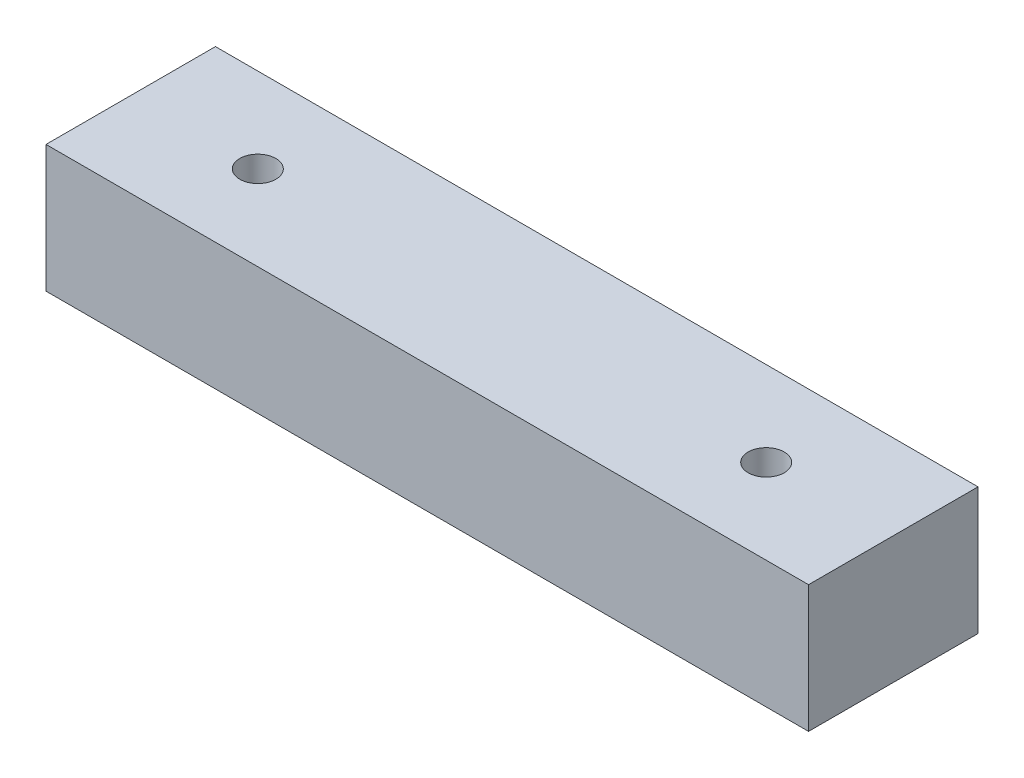
ISO-10303-21;
HEADER;
FILE_DESCRIPTION(('STEP AP214'),'2;1');
FILE_NAME('part.step','',(''),(''),'','','');
FILE_SCHEMA(('AUTOMOTIVE_DESIGN { 1 0 10303 214 1 1 1 1 }'));
ENDSEC;
DATA;
#1=APPLICATION_CONTEXT('core data for automotive mechanical design processes');
#2=APPLICATION_PROTOCOL_DEFINITION('international standard','automotive_design',2000,#1);
#3=PRODUCT_CONTEXT('',#1,'mechanical');
#4=PRODUCT('Part','Part','',(#3));
#5=PRODUCT_RELATED_PRODUCT_CATEGORY('part','',(#4));
#6=PRODUCT_DEFINITION_FORMATION('','',#4);
#7=PRODUCT_DEFINITION_CONTEXT('part definition',#1,'design');
#8=PRODUCT_DEFINITION('design','',#6,#7);
#9=PRODUCT_DEFINITION_SHAPE('','',#8);
#10=(LENGTH_UNIT() NAMED_UNIT(*) SI_UNIT(.MILLI.,.METRE.));
#11=(NAMED_UNIT(*) PLANE_ANGLE_UNIT() SI_UNIT($,.RADIAN.));
#12=(NAMED_UNIT(*) SI_UNIT($,.STERADIAN.) SOLID_ANGLE_UNIT());
#13=UNCERTAINTY_MEASURE_WITH_UNIT(LENGTH_MEASURE(1.E-05),#10,'distance_accuracy_value','');
#14=(GEOMETRIC_REPRESENTATION_CONTEXT(3) GLOBAL_UNCERTAINTY_ASSIGNED_CONTEXT((#13)) GLOBAL_UNIT_ASSIGNED_CONTEXT((#10,
#11,#12)) REPRESENTATION_CONTEXT('',''));
#15=CARTESIAN_POINT('',(0.,0.,0.));
#16=DIRECTION('',(0.,0.,1.));
#17=DIRECTION('',(1.,0.,0.));
#18=AXIS2_PLACEMENT_3D('',#15,#16,#17);
#19=CARTESIAN_POINT('',(-28.575,9.525,6.35));
#20=DIRECTION('',(1.,0.,0.));
#21=DIRECTION('',(0.,0.,-1.));
#22=AXIS2_PLACEMENT_3D('',#19,#20,#21);
#23=PLANE('',#22);
#24=DIRECTION('',(0.,0.,1.));
#25=VECTOR('',#24,1.);
#26=CARTESIAN_POINT('',(-28.575,0.,6.35));
#27=LINE('',#26,#25);
#28=CARTESIAN_POINT('',(-28.575,0.,-6.35));
#29=VERTEX_POINT('',#28);
#30=CARTESIAN_POINT('',(-28.575,0.,6.35));
#31=VERTEX_POINT('',#30);
#32=EDGE_CURVE('E97',#29,#31,#27,.T.);
#33=ORIENTED_EDGE('',*,*,#32,.T.);
#34=DIRECTION('',(0.,-1.,0.));
#35=VECTOR('',#34,1.);
#36=CARTESIAN_POINT('',(-28.575,9.525,6.35));
#37=LINE('',#36,#35);
#38=CARTESIAN_POINT('',(-28.575,9.525,6.35));
#39=VERTEX_POINT('',#38);
#40=EDGE_CURVE('E11',#39,#31,#37,.T.);
#41=ORIENTED_EDGE('',*,*,#40,.F.);
#42=DIRECTION('',(0.,0.,1.));
#43=VECTOR('',#42,1.);
#44=CARTESIAN_POINT('',(-28.575,9.525,6.35));
#45=LINE('',#44,#43);
#46=CARTESIAN_POINT('',(-28.575,9.525,-6.35));
#47=VERTEX_POINT('',#46);
#48=EDGE_CURVE('E85',#47,#39,#45,.T.);
#49=ORIENTED_EDGE('',*,*,#48,.F.);
#50=DIRECTION('',(0.,-1.,0.));
#51=VECTOR('',#50,1.);
#52=CARTESIAN_POINT('',(-28.575,9.525,-6.35));
#53=LINE('',#52,#51);
#54=EDGE_CURVE('E93',#47,#29,#53,.T.);
#55=ORIENTED_EDGE('',*,*,#54,.T.);
#56=EDGE_LOOP('',(#33,#41,#49,#55));
#57=FACE_BOUND('',#56,.T.);
#58=ADVANCED_FACE('F34',(#57),#23,.F.);
#59=CARTESIAN_POINT('',(28.575,9.525,6.35));
#60=DIRECTION('',(0.,0.,-1.));
#61=DIRECTION('',(-1.,0.,0.));
#62=AXIS2_PLACEMENT_3D('',#59,#60,#61);
#63=PLANE('',#62);
#64=DIRECTION('',(1.,0.,0.));
#65=VECTOR('',#64,1.);
#66=CARTESIAN_POINT('',(28.575,0.,6.35));
#67=LINE('',#66,#65);
#68=CARTESIAN_POINT('',(28.575,0.,6.35));
#69=VERTEX_POINT('',#68);
#70=EDGE_CURVE('E89',#31,#69,#67,.T.);
#71=ORIENTED_EDGE('',*,*,#70,.T.);
#72=DIRECTION('',(0.,-1.,0.));
#73=VECTOR('',#72,1.);
#74=CARTESIAN_POINT('',(28.575,9.525,6.35));
#75=LINE('',#74,#73);
#76=CARTESIAN_POINT('',(28.575,9.525,6.35));
#77=VERTEX_POINT('',#76);
#78=EDGE_CURVE('E42',#77,#69,#75,.T.);
#79=ORIENTED_EDGE('',*,*,#78,.F.);
#80=DIRECTION('',(1.,0.,0.));
#81=VECTOR('',#80,1.);
#82=CARTESIAN_POINT('',(28.575,9.525,6.35));
#83=LINE('',#82,#81);
#84=EDGE_CURVE('E80',#39,#77,#83,.T.);
#85=ORIENTED_EDGE('',*,*,#84,.F.);
#86=ORIENTED_EDGE('',*,*,#40,.T.);
#87=EDGE_LOOP('',(#71,#79,#85,#86));
#88=FACE_BOUND('',#87,.T.);
#89=ADVANCED_FACE('F88',(#88),#63,.F.);
#90=CARTESIAN_POINT('',(28.575,9.525,6.35));
#91=DIRECTION('',(-1.,0.,0.));
#92=DIRECTION('',(0.,0.,1.));
#93=AXIS2_PLACEMENT_3D('',#90,#91,#92);
#94=PLANE('',#93);
#95=DIRECTION('',(0.,0.,-1.));
#96=VECTOR('',#95,1.);
#97=CARTESIAN_POINT('',(28.575,0.,6.35));
#98=LINE('',#97,#96);
#99=CARTESIAN_POINT('',(28.575,0.,-6.35));
#100=VERTEX_POINT('',#99);
#101=EDGE_CURVE('E67',#69,#100,#98,.T.);
#102=ORIENTED_EDGE('',*,*,#101,.T.);
#103=DIRECTION('',(0.,-1.,0.));
#104=VECTOR('',#103,1.);
#105=CARTESIAN_POINT('',(28.575,9.525,-6.35));
#106=LINE('',#105,#104);
#107=CARTESIAN_POINT('',(28.575,9.525,-6.35));
#108=VERTEX_POINT('',#107);
#109=EDGE_CURVE('E90',#108,#100,#106,.T.);
#110=ORIENTED_EDGE('',*,*,#109,.F.);
#111=DIRECTION('',(0.,0.,-1.));
#112=VECTOR('',#111,1.);
#113=CARTESIAN_POINT('',(28.575,9.525,6.35));
#114=LINE('',#113,#112);
#115=EDGE_CURVE('E83',#77,#108,#114,.T.);
#116=ORIENTED_EDGE('',*,*,#115,.F.);
#117=ORIENTED_EDGE('',*,*,#78,.T.);
#118=EDGE_LOOP('',(#102,#110,#116,#117));
#119=FACE_BOUND('',#118,.T.);
#120=ADVANCED_FACE('F91',(#119),#94,.F.);
#121=CARTESIAN_POINT('',(28.575,9.525,-6.35));
#122=DIRECTION('',(0.,0.,1.));
#123=DIRECTION('',(1.,0.,0.));
#124=AXIS2_PLACEMENT_3D('',#121,#122,#123);
#125=PLANE('',#124);
#126=DIRECTION('',(-1.,0.,0.));
#127=VECTOR('',#126,1.);
#128=CARTESIAN_POINT('',(28.575,0.,-6.35));
#129=LINE('',#128,#127);
#130=EDGE_CURVE('E73',#100,#29,#129,.T.);
#131=ORIENTED_EDGE('',*,*,#130,.T.);
#132=ORIENTED_EDGE('',*,*,#54,.F.);
#133=DIRECTION('',(-1.,0.,0.));
#134=VECTOR('',#133,1.);
#135=CARTESIAN_POINT('',(28.575,9.525,-6.35));
#136=LINE('',#135,#134);
#137=EDGE_CURVE('E50',#108,#47,#136,.T.);
#138=ORIENTED_EDGE('',*,*,#137,.F.);
#139=ORIENTED_EDGE('',*,*,#109,.T.);
#140=EDGE_LOOP('',(#131,#132,#138,#139));
#141=FACE_BOUND('',#140,.T.);
#142=ADVANCED_FACE('F105',(#141),#125,.F.);
#143=CARTESIAN_POINT('',(-28.575,9.525,-6.35));
#144=DIRECTION('',(0.,1.,0.));
#145=DIRECTION('',(0.,0.,1.));
#146=AXIS2_PLACEMENT_3D('',#143,#144,#145);
#147=PLANE('',#146);
#148=CARTESIAN_POINT('',(19.05,9.525,0.));
#149=DIRECTION('',(0.,-1.,0.));
#150=DIRECTION('',(0.,0.,-1.));
#151=AXIS2_PLACEMENT_3D('',#148,#149,#150);
#152=CIRCLE('',#151,1.35255);
#153=CARTESIAN_POINT('',(19.05,9.525,-1.35255));
#154=VERTEX_POINT('',#153);
#155=EDGE_CURVE('E116',#154,#154,#152,.T.);
#156=ORIENTED_EDGE('',*,*,#155,.T.);
#157=EDGE_LOOP('',(#156));
#158=FACE_BOUND('',#157,.T.);
#159=CARTESIAN_POINT('',(-19.05,9.525,0.));
#160=DIRECTION('',(0.,-1.,0.));
#161=DIRECTION('',(0.,0.,-1.));
#162=AXIS2_PLACEMENT_3D('',#159,#160,#161);
#163=CIRCLE('',#162,1.35255);
#164=CARTESIAN_POINT('',(-19.05,9.525,-1.35255));
#165=VERTEX_POINT('',#164);
#166=EDGE_CURVE('E100',#165,#165,#163,.T.);
#167=ORIENTED_EDGE('',*,*,#166,.T.);
#168=EDGE_LOOP('',(#167));
#169=FACE_BOUND('',#168,.T.);
#170=ORIENTED_EDGE('',*,*,#48,.T.);
#171=ORIENTED_EDGE('',*,*,#84,.T.);
#172=ORIENTED_EDGE('',*,*,#115,.T.);
#173=ORIENTED_EDGE('',*,*,#137,.T.);
#174=EDGE_LOOP('',(#170,#171,#172,#173));
#175=FACE_BOUND('',#174,.T.);
#176=ADVANCED_FACE('F81',(#158,#169,#175),#147,.T.);
#177=CARTESIAN_POINT('',(-28.575,0.,-6.35));
#178=DIRECTION('',(0.,1.,0.));
#179=DIRECTION('',(0.,0.,1.));
#180=AXIS2_PLACEMENT_3D('',#177,#178,#179);
#181=PLANE('',#180);
#182=CARTESIAN_POINT('',(19.05,0.,0.));
#183=DIRECTION('',(0.,-1.,0.));
#184=DIRECTION('',(0.,0.,-1.));
#185=AXIS2_PLACEMENT_3D('',#182,#183,#184);
#186=CIRCLE('',#185,1.35255);
#187=CARTESIAN_POINT('',(19.05,0.,-1.35255));
#188=VERTEX_POINT('',#187);
#189=EDGE_CURVE('E119',#188,#188,#186,.T.);
#190=ORIENTED_EDGE('',*,*,#189,.F.);
#191=EDGE_LOOP('',(#190));
#192=FACE_BOUND('',#191,.T.);
#193=CARTESIAN_POINT('',(-19.05,0.,0.));
#194=DIRECTION('',(0.,-1.,0.));
#195=DIRECTION('',(0.,0.,-1.));
#196=AXIS2_PLACEMENT_3D('',#193,#194,#195);
#197=CIRCLE('',#196,1.35255);
#198=CARTESIAN_POINT('',(-19.05,0.,-1.35255));
#199=VERTEX_POINT('',#198);
#200=EDGE_CURVE('E113',#199,#199,#197,.T.);
#201=ORIENTED_EDGE('',*,*,#200,.F.);
#202=EDGE_LOOP('',(#201));
#203=FACE_BOUND('',#202,.T.);
#204=ORIENTED_EDGE('',*,*,#32,.F.);
#205=ORIENTED_EDGE('',*,*,#130,.F.);
#206=ORIENTED_EDGE('',*,*,#101,.F.);
#207=ORIENTED_EDGE('',*,*,#70,.F.);
#208=EDGE_LOOP('',(#204,#205,#206,#207));
#209=FACE_BOUND('',#208,.T.);
#210=ADVANCED_FACE('F108',(#192,#203,#209),#181,.F.);
#211=CARTESIAN_POINT('',(-19.05,0.,0.));
#212=DIRECTION('',(0.,-1.,0.));
#213=DIRECTION('',(0.,0.,-1.));
#214=AXIS2_PLACEMENT_3D('',#211,#212,#213);
#215=CYLINDRICAL_SURFACE('',#214,1.35255);
#216=ORIENTED_EDGE('',*,*,#166,.F.);
#217=EDGE_LOOP('',(#216));
#218=FACE_BOUND('',#217,.T.);
#219=ORIENTED_EDGE('',*,*,#200,.T.);
#220=EDGE_LOOP('',(#219));
#221=FACE_BOUND('',#220,.T.);
#222=ADVANCED_FACE('F127',(#218,#221),#215,.F.);
#223=CARTESIAN_POINT('',(19.05,0.,0.));
#224=DIRECTION('',(0.,-1.,0.));
#225=DIRECTION('',(0.,0.,-1.));
#226=AXIS2_PLACEMENT_3D('',#223,#224,#225);
#227=CYLINDRICAL_SURFACE('',#226,1.35255);
#228=ORIENTED_EDGE('',*,*,#155,.F.);
#229=EDGE_LOOP('',(#228));
#230=FACE_BOUND('',#229,.T.);
#231=ORIENTED_EDGE('',*,*,#189,.T.);
#232=EDGE_LOOP('',(#231));
#233=FACE_BOUND('',#232,.T.);
#234=ADVANCED_FACE('F123',(#230,#233),#227,.F.);
#235=CLOSED_SHELL('',(#58,#89,#120,#142,#176,#210,#222,#234));
#236=MANIFOLD_SOLID_BREP('B2',#235);
#237=ADVANCED_BREP_SHAPE_REPRESENTATION('',(#18,#236),#14);
#238=SHAPE_DEFINITION_REPRESENTATION(#9,#237);
ENDSEC;
END-ISO-10303-21;
